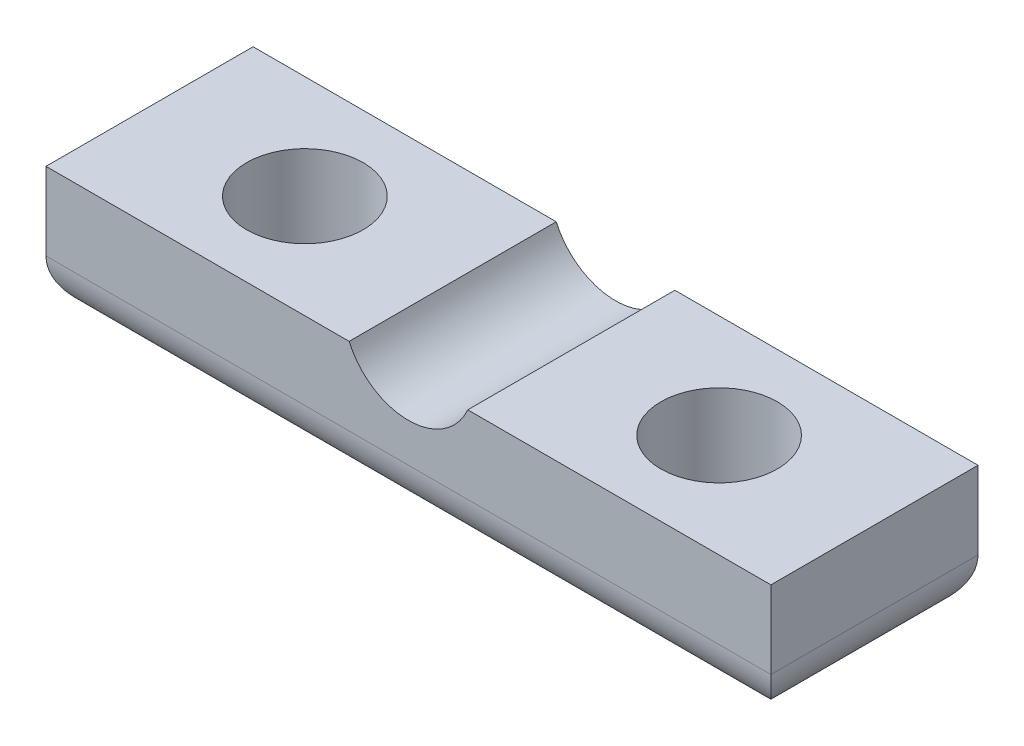
ISO-10303-21;
HEADER;
FILE_DESCRIPTION(('STEP AP214'),'2;1');
FILE_NAME('part.step','',(''),(''),'','','');
FILE_SCHEMA(('AUTOMOTIVE_DESIGN { 1 0 10303 214 1 1 1 1 }'));
ENDSEC;
DATA;
#1=APPLICATION_CONTEXT('core data for automotive mechanical design processes');
#2=APPLICATION_PROTOCOL_DEFINITION('international standard','automotive_design',2000,#1);
#3=PRODUCT_CONTEXT('',#1,'mechanical');
#4=PRODUCT('Part','Part','',(#3));
#5=PRODUCT_RELATED_PRODUCT_CATEGORY('part','',(#4));
#6=PRODUCT_DEFINITION_FORMATION('','',#4);
#7=PRODUCT_DEFINITION_CONTEXT('part definition',#1,'design');
#8=PRODUCT_DEFINITION('design','',#6,#7);
#9=PRODUCT_DEFINITION_SHAPE('','',#8);
#10=(LENGTH_UNIT() NAMED_UNIT(*) SI_UNIT(.MILLI.,.METRE.));
#11=(NAMED_UNIT(*) PLANE_ANGLE_UNIT() SI_UNIT($,.RADIAN.));
#12=(NAMED_UNIT(*) SI_UNIT($,.STERADIAN.) SOLID_ANGLE_UNIT());
#13=UNCERTAINTY_MEASURE_WITH_UNIT(LENGTH_MEASURE(1.E-05),#10,'distance_accuracy_value','');
#14=(GEOMETRIC_REPRESENTATION_CONTEXT(3) GLOBAL_UNCERTAINTY_ASSIGNED_CONTEXT((#13)) GLOBAL_UNIT_ASSIGNED_CONTEXT((#10,
#11,#12)) REPRESENTATION_CONTEXT('',''));
#15=CARTESIAN_POINT('',(0.,0.,0.));
#16=DIRECTION('',(0.,0.,1.));
#17=DIRECTION('',(1.,0.,0.));
#18=AXIS2_PLACEMENT_3D('',#15,#16,#17);
#19=CARTESIAN_POINT('',(0.,0.,0.));
#20=DIRECTION('',(0.,1.,0.));
#21=DIRECTION('',(0.,0.,1.));
#22=AXIS2_PLACEMENT_3D('',#19,#20,#21);
#23=PLANE('',#22);
#24=CARTESIAN_POINT('',(6.,0.,-4.));
#25=DIRECTION('',(0.,1.,0.));
#26=DIRECTION('',(0.,0.,1.));
#27=AXIS2_PLACEMENT_3D('',#24,#25,#26);
#28=CIRCLE('',#27,2.25);
#29=CARTESIAN_POINT('',(7.03077640640442,0.,-2.));
#30=VERTEX_POINT('',#29);
#31=CARTESIAN_POINT('',(7.03077640640442,0.,-6.));
#32=VERTEX_POINT('',#31);
#33=EDGE_CURVE('E298',#30,#32,#28,.T.);
#34=ORIENTED_EDGE('',*,*,#33,.T.);
#35=DIRECTION('',(-1.,0.,0.));
#36=VECTOR('',#35,1.);
#37=CARTESIAN_POINT('',(0.,0.,-6.));
#38=LINE('',#37,#36);
#39=CARTESIAN_POINT('',(20.9692235935956,0.,-6.));
#40=VERTEX_POINT('',#39);
#41=EDGE_CURVE('E193',#32,#40,#38,.F.);
#42=ORIENTED_EDGE('',*,*,#41,.T.);
#43=CARTESIAN_POINT('',(22.,0.,-4.));
#44=DIRECTION('',(0.,1.,0.));
#45=DIRECTION('',(0.,0.,1.));
#46=AXIS2_PLACEMENT_3D('',#43,#44,#45);
#47=CIRCLE('',#46,2.25);
#48=CARTESIAN_POINT('',(20.9692235935956,0.,-2.));
#49=VERTEX_POINT('',#48);
#50=EDGE_CURVE('E290',#40,#49,#47,.T.);
#51=ORIENTED_EDGE('',*,*,#50,.T.);
#52=DIRECTION('',(1.,0.,0.));
#53=VECTOR('',#52,1.);
#54=CARTESIAN_POINT('',(0.,0.,-2.));
#55=LINE('',#54,#53);
#56=EDGE_CURVE('E185',#49,#30,#55,.F.);
#57=ORIENTED_EDGE('',*,*,#56,.T.);
#58=EDGE_LOOP('',(#34,#42,#51,#57));
#59=FACE_BOUND('',#58,.T.);
#60=ADVANCED_FACE('F41',(#59),#23,.F.);
#61=CARTESIAN_POINT('',(23.0307764064044,0.,-2.));
#62=VERTEX_POINT('',#61);
#63=CARTESIAN_POINT('',(23.0307764064044,0.,-6.));
#64=VERTEX_POINT('',#63);
#65=EDGE_CURVE('E283',#62,#64,#47,.T.);
#66=ORIENTED_EDGE('',*,*,#65,.T.);
#67=DIRECTION('',(-1.,0.,0.));
#68=VECTOR('',#67,1.);
#69=CARTESIAN_POINT('',(0.,0.,-6.));
#70=LINE('',#69,#68);
#71=CARTESIAN_POINT('',(26.,0.,-6.));
#72=VERTEX_POINT('',#71);
#73=EDGE_CURVE('E191',#64,#72,#70,.F.);
#74=ORIENTED_EDGE('',*,*,#73,.T.);
#75=DIRECTION('',(0.,0.,-1.));
#76=VECTOR('',#75,1.);
#77=CARTESIAN_POINT('',(26.,0.,0.));
#78=LINE('',#77,#76);
#79=CARTESIAN_POINT('',(26.,0.,-2.));
#80=VERTEX_POINT('',#79);
#81=EDGE_CURVE('E189',#72,#80,#78,.F.);
#82=ORIENTED_EDGE('',*,*,#81,.T.);
#83=DIRECTION('',(1.,0.,0.));
#84=VECTOR('',#83,1.);
#85=CARTESIAN_POINT('',(0.,0.,-2.));
#86=LINE('',#85,#84);
#87=EDGE_CURVE('E187',#80,#62,#86,.F.);
#88=ORIENTED_EDGE('',*,*,#87,.T.);
#89=EDGE_LOOP('',(#66,#74,#82,#88));
#90=FACE_BOUND('',#89,.T.);
#91=ADVANCED_FACE('F228',(#90),#23,.F.);
#92=CARTESIAN_POINT('',(0.,5.,0.));
#93=DIRECTION('',(0.,1.,0.));
#94=DIRECTION('',(0.,0.,1.));
#95=AXIS2_PLACEMENT_3D('',#92,#93,#94);
#96=PLANE('',#95);
#97=DIRECTION('',(0.,0.,1.));
#98=VECTOR('',#97,1.);
#99=CARTESIAN_POINT('',(11.7087121525221,5.,-8.001));
#100=LINE('',#99,#98);
#101=CARTESIAN_POINT('',(11.7087121525221,5.,0.));
#102=VERTEX_POINT('',#101);
#103=CARTESIAN_POINT('',(11.7087121525221,5.,-8.));
#104=VERTEX_POINT('',#103);
#105=EDGE_CURVE('E139',#102,#104,#100,.F.);
#106=ORIENTED_EDGE('',*,*,#105,.T.);
#107=DIRECTION('',(-1.,0.,0.));
#108=VECTOR('',#107,1.);
#109=CARTESIAN_POINT('',(0.,5.,-8.));
#110=LINE('',#109,#108);
#111=CARTESIAN_POINT('',(0.,5.,-8.));
#112=VERTEX_POINT('',#111);
#113=EDGE_CURVE('E165',#104,#112,#110,.T.);
#114=ORIENTED_EDGE('',*,*,#113,.T.);
#115=DIRECTION('',(0.,0.,1.));
#116=VECTOR('',#115,1.);
#117=CARTESIAN_POINT('',(0.,5.,-8.));
#118=LINE('',#117,#116);
#119=CARTESIAN_POINT('',(0.,5.,0.));
#120=VERTEX_POINT('',#119);
#121=EDGE_CURVE('E156',#112,#120,#118,.T.);
#122=ORIENTED_EDGE('',*,*,#121,.T.);
#123=DIRECTION('',(1.,0.,0.));
#124=VECTOR('',#123,1.);
#125=CARTESIAN_POINT('',(0.,5.,0.));
#126=LINE('',#125,#124);
#127=EDGE_CURVE('E155',#120,#102,#126,.T.);
#128=ORIENTED_EDGE('',*,*,#127,.T.);
#129=EDGE_LOOP('',(#106,#114,#122,#128));
#130=FACE_BOUND('',#129,.T.);
#131=CARTESIAN_POINT('',(6.,5.,-4.));
#132=DIRECTION('',(0.,1.,0.));
#133=DIRECTION('',(0.,0.,1.));
#134=AXIS2_PLACEMENT_3D('',#131,#132,#133);
#135=CIRCLE('',#134,2.25);
#136=CARTESIAN_POINT('',(6.,5.,-1.75));
#137=VERTEX_POINT('',#136);
#138=EDGE_CURVE('E160',#137,#137,#135,.T.);
#139=ORIENTED_EDGE('',*,*,#138,.F.);
#140=EDGE_LOOP('',(#139));
#141=FACE_BOUND('',#140,.T.);
#142=ADVANCED_FACE('F223',(#130,#141),#96,.T.);
#143=DIRECTION('',(0.,0.,1.));
#144=VECTOR('',#143,1.);
#145=CARTESIAN_POINT('',(16.2912878474779,5.,-8.001));
#146=LINE('',#145,#144);
#147=CARTESIAN_POINT('',(16.2912878474779,5.,-8.));
#148=VERTEX_POINT('',#147);
#149=CARTESIAN_POINT('',(16.2912878474779,5.,0.));
#150=VERTEX_POINT('',#149);
#151=EDGE_CURVE('E136',#148,#150,#146,.T.);
#152=ORIENTED_EDGE('',*,*,#151,.T.);
#153=CARTESIAN_POINT('',(28.,5.,0.));
#154=VERTEX_POINT('',#153);
#155=EDGE_CURVE('E148',#150,#154,#126,.T.);
#156=ORIENTED_EDGE('',*,*,#155,.T.);
#157=DIRECTION('',(0.,0.,-1.));
#158=VECTOR('',#157,1.);
#159=CARTESIAN_POINT('',(28.,5.,-8.));
#160=LINE('',#159,#158);
#161=CARTESIAN_POINT('',(28.,5.,-8.));
#162=VERTEX_POINT('',#161);
#163=EDGE_CURVE('E158',#154,#162,#160,.T.);
#164=ORIENTED_EDGE('',*,*,#163,.T.);
#165=EDGE_CURVE('E150',#162,#148,#110,.T.);
#166=ORIENTED_EDGE('',*,*,#165,.T.);
#167=EDGE_LOOP('',(#152,#156,#164,#166));
#168=FACE_BOUND('',#167,.T.);
#169=CARTESIAN_POINT('',(22.,5.,-4.));
#170=DIRECTION('',(0.,1.,0.));
#171=DIRECTION('',(0.,0.,1.));
#172=AXIS2_PLACEMENT_3D('',#169,#170,#171);
#173=CIRCLE('',#172,2.25);
#174=CARTESIAN_POINT('',(22.,5.,-1.75));
#175=VERTEX_POINT('',#174);
#176=EDGE_CURVE('E289',#175,#175,#173,.T.);
#177=ORIENTED_EDGE('',*,*,#176,.F.);
#178=EDGE_LOOP('',(#177));
#179=FACE_BOUND('',#178,.T.);
#180=ADVANCED_FACE('F146',(#168,#179),#96,.T.);
#181=DIRECTION('',(0.,0.,1.));
#182=VECTOR('',#181,1.);
#183=CARTESIAN_POINT('',(2.,0.,0.));
#184=LINE('',#183,#182);
#185=CARTESIAN_POINT('',(2.,0.,-2.));
#186=VERTEX_POINT('',#185);
#187=CARTESIAN_POINT('',(2.,0.,-6.));
#188=VERTEX_POINT('',#187);
#189=EDGE_CURVE('E180',#186,#188,#184,.F.);
#190=ORIENTED_EDGE('',*,*,#189,.T.);
#191=DIRECTION('',(-1.,0.,0.));
#192=VECTOR('',#191,1.);
#193=CARTESIAN_POINT('',(0.,0.,-6.));
#194=LINE('',#193,#192);
#195=CARTESIAN_POINT('',(4.96922359359558,0.,-6.));
#196=VERTEX_POINT('',#195);
#197=EDGE_CURVE('E182',#188,#196,#194,.F.);
#198=ORIENTED_EDGE('',*,*,#197,.T.);
#199=CARTESIAN_POINT('',(4.96922359359558,0.,-2.));
#200=VERTEX_POINT('',#199);
#201=EDGE_CURVE('E293',#196,#200,#28,.T.);
#202=ORIENTED_EDGE('',*,*,#201,.T.);
#203=DIRECTION('',(1.,0.,0.));
#204=VECTOR('',#203,1.);
#205=CARTESIAN_POINT('',(0.,0.,-2.));
#206=LINE('',#205,#204);
#207=EDGE_CURVE('E178',#200,#186,#206,.F.);
#208=ORIENTED_EDGE('',*,*,#207,.T.);
#209=EDGE_LOOP('',(#190,#198,#202,#208));
#210=FACE_BOUND('',#209,.T.);
#211=ADVANCED_FACE('F222',(#210),#23,.F.);
#212=CARTESIAN_POINT('',(0.,5.,-8.));
#213=DIRECTION('',(1.,0.,0.));
#214=DIRECTION('',(0.,0.,-1.));
#215=AXIS2_PLACEMENT_3D('',#212,#213,#214);
#216=PLANE('',#215);
#217=DIRECTION('',(0.,-1.,0.));
#218=VECTOR('',#217,1.);
#219=CARTESIAN_POINT('',(0.,5.,-8.));
#220=LINE('',#219,#218);
#221=CARTESIAN_POINT('',(0.,2.,-8.));
#222=VERTEX_POINT('',#221);
#223=EDGE_CURVE('E167',#112,#222,#220,.T.);
#224=ORIENTED_EDGE('',*,*,#223,.T.);
#225=DIRECTION('',(0.,0.,1.));
#226=VECTOR('',#225,1.);
#227=CARTESIAN_POINT('',(0.,2.,-8.));
#228=LINE('',#227,#226);
#229=CARTESIAN_POINT('',(0.,2.,0.));
#230=VERTEX_POINT('',#229);
#231=EDGE_CURVE('E65',#222,#230,#228,.T.);
#232=ORIENTED_EDGE('',*,*,#231,.T.);
#233=DIRECTION('',(0.,-1.,0.));
#234=VECTOR('',#233,1.);
#235=CARTESIAN_POINT('',(0.,5.,0.));
#236=LINE('',#235,#234);
#237=EDGE_CURVE('E173',#120,#230,#236,.T.);
#238=ORIENTED_EDGE('',*,*,#237,.F.);
#239=ORIENTED_EDGE('',*,*,#121,.F.);
#240=EDGE_LOOP('',(#224,#232,#238,#239));
#241=FACE_BOUND('',#240,.T.);
#242=ADVANCED_FACE('F226',(#241),#216,.F.);
#243=CARTESIAN_POINT('',(0.,5.,0.));
#244=DIRECTION('',(0.,0.,-1.));
#245=DIRECTION('',(-1.,0.,0.));
#246=AXIS2_PLACEMENT_3D('',#243,#244,#245);
#247=PLANE('',#246);
#248=ORIENTED_EDGE('',*,*,#237,.T.);
#249=DIRECTION('',(1.,0.,0.));
#250=VECTOR('',#249,1.);
#251=CARTESIAN_POINT('',(0.,2.,0.));
#252=LINE('',#251,#250);
#253=CARTESIAN_POINT('',(28.,2.,0.));
#254=VERTEX_POINT('',#253);
#255=EDGE_CURVE('E11',#230,#254,#252,.T.);
#256=ORIENTED_EDGE('',*,*,#255,.T.);
#257=DIRECTION('',(0.,-1.,0.));
#258=VECTOR('',#257,1.);
#259=CARTESIAN_POINT('',(28.,5.,0.));
#260=LINE('',#259,#258);
#261=EDGE_CURVE('E153',#154,#254,#260,.T.);
#262=ORIENTED_EDGE('',*,*,#261,.F.);
#263=ORIENTED_EDGE('',*,*,#155,.F.);
#264=CARTESIAN_POINT('',(14.,6.,0.));
#265=DIRECTION('',(0.,0.,1.));
#266=DIRECTION('',(1.,0.,0.));
#267=AXIS2_PLACEMENT_3D('',#264,#265,#266);
#268=CIRCLE('',#267,2.5);
#269=EDGE_CURVE('E133',#102,#150,#268,.T.);
#270=ORIENTED_EDGE('',*,*,#269,.F.);
#271=ORIENTED_EDGE('',*,*,#127,.F.);
#272=EDGE_LOOP('',(#248,#256,#262,#263,#270,#271));
#273=FACE_BOUND('',#272,.T.);
#274=ADVANCED_FACE('F152',(#273),#247,.F.);
#275=CARTESIAN_POINT('',(28.,5.,-8.));
#276=DIRECTION('',(-1.,0.,0.));
#277=DIRECTION('',(0.,0.,1.));
#278=AXIS2_PLACEMENT_3D('',#275,#276,#277);
#279=PLANE('',#278);
#280=ORIENTED_EDGE('',*,*,#261,.T.);
#281=DIRECTION('',(0.,0.,-1.));
#282=VECTOR('',#281,1.);
#283=CARTESIAN_POINT('',(28.,2.,-8.));
#284=LINE('',#283,#282);
#285=CARTESIAN_POINT('',(28.,2.,-8.));
#286=VERTEX_POINT('',#285);
#287=EDGE_CURVE('E51',#254,#286,#284,.T.);
#288=ORIENTED_EDGE('',*,*,#287,.T.);
#289=DIRECTION('',(0.,-1.,0.));
#290=VECTOR('',#289,1.);
#291=CARTESIAN_POINT('',(28.,5.,-8.));
#292=LINE('',#291,#290);
#293=EDGE_CURVE('E169',#162,#286,#292,.T.);
#294=ORIENTED_EDGE('',*,*,#293,.F.);
#295=ORIENTED_EDGE('',*,*,#163,.F.);
#296=EDGE_LOOP('',(#280,#288,#294,#295));
#297=FACE_BOUND('',#296,.T.);
#298=ADVANCED_FACE('F231',(#297),#279,.F.);
#299=CARTESIAN_POINT('',(0.,5.,-8.));
#300=DIRECTION('',(0.,0.,1.));
#301=DIRECTION('',(1.,0.,0.));
#302=AXIS2_PLACEMENT_3D('',#299,#300,#301);
#303=PLANE('',#302);
#304=ORIENTED_EDGE('',*,*,#293,.T.);
#305=DIRECTION('',(-1.,0.,0.));
#306=VECTOR('',#305,1.);
#307=CARTESIAN_POINT('',(0.,2.,-8.));
#308=LINE('',#307,#306);
#309=EDGE_CURVE('E175',#286,#222,#308,.T.);
#310=ORIENTED_EDGE('',*,*,#309,.T.);
#311=ORIENTED_EDGE('',*,*,#223,.F.);
#312=ORIENTED_EDGE('',*,*,#113,.F.);
#313=CARTESIAN_POINT('',(14.,6.,-8.));
#314=DIRECTION('',(0.,0.,1.));
#315=DIRECTION('',(1.,0.,0.));
#316=AXIS2_PLACEMENT_3D('',#313,#314,#315);
#317=CIRCLE('',#316,2.5);
#318=EDGE_CURVE('E142',#148,#104,#317,.F.);
#319=ORIENTED_EDGE('',*,*,#318,.F.);
#320=ORIENTED_EDGE('',*,*,#165,.F.);
#321=EDGE_LOOP('',(#304,#310,#311,#312,#319,#320));
#322=FACE_BOUND('',#321,.T.);
#323=ADVANCED_FACE('F215',(#322),#303,.F.);
#324=CARTESIAN_POINT('',(6.,5.,-4.));
#325=DIRECTION('',(0.,-1.,0.));
#326=DIRECTION('',(0.,0.,-1.));
#327=AXIS2_PLACEMENT_3D('',#324,#325,#326);
#328=CYLINDRICAL_SURFACE('',#327,2.25);
#329=ORIENTED_EDGE('',*,*,#138,.T.);
#330=EDGE_LOOP('',(#329));
#331=FACE_BOUND('',#330,.T.);
#332=ORIENTED_EDGE('',*,*,#201,.F.);
#333=CARTESIAN_POINT('',(4.96922359359558,0.,-6.));
#334=CARTESIAN_POINT('',(5.02539735107105,1.52558001636132E-05,-6.02895862122767));
#335=CARTESIAN_POINT('',(5.08278963496504,0.000629627856996924,-6.05553535569634));
#336=CARTESIAN_POINT('',(5.19959134872419,0.00254373186729327,-6.10376565723493));
#337=CARTESIAN_POINT('',(5.25900060992354,0.00384340664507496,-6.12541963480109));
#338=CARTESIAN_POINT('',(5.3793536073234,0.00661375347529402,-6.1636269681991));
#339=CARTESIAN_POINT('',(5.44029541606852,0.00808421840381634,-6.18018641520903));
#340=CARTESIAN_POINT('',(5.56335885030774,0.0108088193640124,-6.20812706255428));
#341=CARTESIAN_POINT('',(5.62548045408171,0.0120629593739709,-6.21950835812376));
#342=CARTESIAN_POINT('',(5.75051567773631,0.0140743725760321,-6.23701710175278));
#343=CARTESIAN_POINT('',(5.81342985237115,0.0148312754900123,-6.24314063554815));
#344=CARTESIAN_POINT('',(5.93957760880453,0.0156930077279623,-6.25007588346231));
#345=CARTESIAN_POINT('',(6.00281130113264,0.0157975933784894,-6.25088561261258));
#346=CARTESIAN_POINT('',(6.12907583671838,0.0153323700147689,-6.24718128194423));
#347=CARTESIAN_POINT('',(6.19210679764039,0.0147630736245386,-6.24267126887807));
#348=CARTESIAN_POINT('',(6.31756317267604,0.0130690887375425,-6.22837296318195));
#349=CARTESIAN_POINT('',(6.37998839081447,0.0119442262316625,-6.21858301673324));
#350=CARTESIAN_POINT('',(6.54416887162481,0.008527509013293,-6.18568855561695));
#351=CARTESIAN_POINT('',(6.64506499516112,0.0059527108171159,-6.1580651499093));
#352=CARTESIAN_POINT('',(6.7927274994465,0.0027584431031845,-6.10637480077624));
#353=CARTESIAN_POINT('',(6.8413493783086,0.00180481476181779,-6.08742793214148));
#354=CARTESIAN_POINT('',(6.9371758863136,0.000427731988449566,-6.04619612932464));
#355=CARTESIAN_POINT('',(6.98438021558466,4.38897384282001E-06,-6.02391049474071));
#356=CARTESIAN_POINT('',(7.03077640640442,0.,-6.));
#357=B_SPLINE_CURVE_WITH_KNOTS('',3,(#333,#334,#335,#336,#337,#338,#339,#340,#341,#342,#343,
#344,#345,#346,#347,#348,#349,#350,#351,#352,#353,#354,#355,#356),.UNSPECIFIED.,.F.,.F.,(4,2,2,
2,2,2,2,2,2,2,2,4),(0.,0.189526602351568,0.379037394757997,0.568320713639339,0.757600551168464,
0.947021180636778,1.13651256404109,1.32585989338827,1.51526656594334,1.82800916052711,
1.98447854453795,2.14098079856731),.UNSPECIFIED.);
#358=EDGE_CURVE('E202',#196,#32,#357,.T.);
#359=ORIENTED_EDGE('',*,*,#358,.T.);
#360=ORIENTED_EDGE('',*,*,#33,.F.);
#361=CARTESIAN_POINT('',(7.03077640640442,0.,-2.));
#362=CARTESIAN_POINT('',(6.97460264892895,1.52558001637052E-05,-1.97104137877233));
#363=CARTESIAN_POINT('',(6.91721036503496,0.000629627856996939,-1.94446464430366));
#364=CARTESIAN_POINT('',(6.80040865127581,0.00254373186729314,-1.89623434276507));
#365=CARTESIAN_POINT('',(6.74099939007646,0.00384340664507478,-1.87458036519891));
#366=CARTESIAN_POINT('',(6.6206463926766,0.00661375347529411,-1.8363730318009));
#367=CARTESIAN_POINT('',(6.55970458393148,0.00808421840381675,-1.81981358479097));
#368=CARTESIAN_POINT('',(6.43664114969226,0.0108088193640128,-1.79187293744572));
#369=CARTESIAN_POINT('',(6.37451954591829,0.0120629593739708,-1.78049164187624));
#370=CARTESIAN_POINT('',(6.24948432226369,0.014074372576032,-1.76298289824721));
#371=CARTESIAN_POINT('',(6.18657014762885,0.0148312754900126,-1.75685936445185));
#372=CARTESIAN_POINT('',(6.06042239119547,0.0156930077279627,-1.74992411653769));
#373=CARTESIAN_POINT('',(5.99718869886736,0.0157975933784894,-1.74911438738742));
#374=CARTESIAN_POINT('',(5.87092416328162,0.0153323700147688,-1.75281871805577));
#375=CARTESIAN_POINT('',(5.80789320235961,0.0147630736245389,-1.75732873112193));
#376=CARTESIAN_POINT('',(5.68243682732396,0.0130690887375429,-1.77162703681805));
#377=CARTESIAN_POINT('',(5.62001160918553,0.0119442262316626,-1.78141698326676));
#378=CARTESIAN_POINT('',(5.45583112837519,0.00852750901329275,-1.81431144438305));
#379=CARTESIAN_POINT('',(5.35493500483888,0.00595271081711586,-1.8419348500907));
#380=CARTESIAN_POINT('',(5.2072725005535,0.00275844310318455,-1.89362519922376));
#381=CARTESIAN_POINT('',(5.1586506216914,0.00180481476181783,-1.91257206785852));
#382=CARTESIAN_POINT('',(5.0628241136864,0.000427731988449564,-1.95380387067536));
#383=CARTESIAN_POINT('',(5.01561978441534,4.38897384279923E-06,-1.97608950525929));
#384=CARTESIAN_POINT('',(4.96922359359558,0.,-2.));
#385=B_SPLINE_CURVE_WITH_KNOTS('',3,(#361,#362,#363,#364,#365,#366,#367,#368,#369,#370,#371,
#372,#373,#374,#375,#376,#377,#378,#379,#380,#381,#382,#383,#384),.UNSPECIFIED.,.F.,.F.,(4,2,2,
2,2,2,2,2,2,2,2,4),(0.,0.189526602351567,0.379037394757997,0.568320713639341,0.757600551168464,
0.947021180636777,1.13651256404109,1.32585989338827,1.51526656594334,1.82800916052711,
1.98447854453795,2.14098079856731),.UNSPECIFIED.);
#386=EDGE_CURVE('E195',#30,#200,#385,.T.);
#387=ORIENTED_EDGE('',*,*,#386,.T.);
#388=EDGE_LOOP('',(#332,#359,#360,#387));
#389=FACE_BOUND('',#388,.T.);
#390=ADVANCED_FACE('F209',(#331,#389),#328,.F.);
#391=CARTESIAN_POINT('',(22.,5.,-4.));
#392=DIRECTION('',(0.,-1.,0.));
#393=DIRECTION('',(0.,0.,-1.));
#394=AXIS2_PLACEMENT_3D('',#391,#392,#393);
#395=CYLINDRICAL_SURFACE('',#394,2.25);
#396=ORIENTED_EDGE('',*,*,#176,.T.);
#397=EDGE_LOOP('',(#396));
#398=FACE_BOUND('',#397,.T.);
#399=ORIENTED_EDGE('',*,*,#50,.F.);
#400=CARTESIAN_POINT('',(20.9692235935956,0.,-6.));
#401=CARTESIAN_POINT('',(21.0253973510711,1.52558001640079E-05,-6.02895862122767));
#402=CARTESIAN_POINT('',(21.082789634965,0.000629627856997276,-6.05553535569634));
#403=CARTESIAN_POINT('',(21.1995913487242,0.00254373186729338,-6.10376565723493));
#404=CARTESIAN_POINT('',(21.2590006099235,0.00384340664507488,-6.12541963480109));
#405=CARTESIAN_POINT('',(21.3793536073234,0.00661375347529412,-6.1636269681991));
#406=CARTESIAN_POINT('',(21.4402954160685,0.00808421840381682,-6.18018641520903));
#407=CARTESIAN_POINT('',(21.5633588503077,0.0108088193640131,-6.20812706255427));
#408=CARTESIAN_POINT('',(21.6254804540817,0.0120629593739714,-6.21950835812376));
#409=CARTESIAN_POINT('',(21.7505156777363,0.0140743725760324,-6.23701710175278));
#410=CARTESIAN_POINT('',(21.8134298523712,0.0148312754900125,-6.24314063554815));
#411=CARTESIAN_POINT('',(21.9395776088045,0.0156930077279623,-6.2500758834623));
#412=CARTESIAN_POINT('',(22.0028113011326,0.0157975933784892,-6.25088561261258));
#413=CARTESIAN_POINT('',(22.1290758367184,0.0153323700147685,-6.24718128194423));
#414=CARTESIAN_POINT('',(22.1921067976404,0.0147630736245382,-6.24267126887807));
#415=CARTESIAN_POINT('',(22.317563172676,0.0130690887375421,-6.22837296318195));
#416=CARTESIAN_POINT('',(22.3799883908145,0.0119442262316621,-6.21858301673324));
#417=CARTESIAN_POINT('',(22.5441688716248,0.0085275090132926,-6.18568855561695));
#418=CARTESIAN_POINT('',(22.6450649951611,0.0059527108171154,-6.1580651499093));
#419=CARTESIAN_POINT('',(22.7927274994465,0.00275844310318408,-6.10637480077623));
#420=CARTESIAN_POINT('',(22.8413493783086,0.00180481476181744,-6.08742793214147));
#421=CARTESIAN_POINT('',(22.9371758863136,0.000427731988449439,-6.04619612932464));
#422=CARTESIAN_POINT('',(22.9843802155847,4.38897384285513E-06,-6.02391049474071));
#423=CARTESIAN_POINT('',(23.0307764064044,0.,-6.));
#424=B_SPLINE_CURVE_WITH_KNOTS('',3,(#400,#401,#402,#403,#404,#405,#406,#407,#408,#409,#410,
#411,#412,#413,#414,#415,#416,#417,#418,#419,#420,#421,#422,#423),.UNSPECIFIED.,.F.,.F.,(4,2,2,
2,2,2,2,2,2,2,2,4),(0.,0.189526602351569,0.379037394758,0.568320713639339,0.757600551168462,
0.947021180636776,1.13651256404109,1.32585989338826,1.51526656594334,1.82800916052711,
1.98447854453794,2.1409807985673),.UNSPECIFIED.);
#425=EDGE_CURVE('E247',#40,#64,#424,.T.);
#426=ORIENTED_EDGE('',*,*,#425,.T.);
#427=ORIENTED_EDGE('',*,*,#65,.F.);
#428=CARTESIAN_POINT('',(23.0307764064044,0.,-2.));
#429=CARTESIAN_POINT('',(22.9746026489289,1.52558001639053E-05,-1.97104137877233));
#430=CARTESIAN_POINT('',(22.917210365035,0.000629627856997255,-1.94446464430366));
#431=CARTESIAN_POINT('',(22.8004086512758,0.00254373186729352,-1.89623434276507));
#432=CARTESIAN_POINT('',(22.7409993900765,0.0038434066450751,-1.87458036519891));
#433=CARTESIAN_POINT('',(22.6206463926766,0.00661375347529413,-1.8363730318009));
#434=CARTESIAN_POINT('',(22.5597045839315,0.00808421840381654,-1.81981358479097));
#435=CARTESIAN_POINT('',(22.4366411496923,0.0108088193640128,-1.79187293744573));
#436=CARTESIAN_POINT('',(22.3745195459183,0.0120629593739713,-1.78049164187624));
#437=CARTESIAN_POINT('',(22.2494843222637,0.0140743725760325,-1.76298289824722));
#438=CARTESIAN_POINT('',(22.1865701476288,0.0148312754900126,-1.75685936445185));
#439=CARTESIAN_POINT('',(22.0604223911955,0.0156930077279622,-1.74992411653769));
#440=CARTESIAN_POINT('',(21.9971886988674,0.0157975933784889,-1.74911438738742));
#441=CARTESIAN_POINT('',(21.8709241632816,0.0153323700147684,-1.75281871805577));
#442=CARTESIAN_POINT('',(21.8078932023596,0.0147630736245385,-1.75732873112193));
#443=CARTESIAN_POINT('',(21.682436827324,0.0130690887375425,-1.77162703681805));
#444=CARTESIAN_POINT('',(21.6200116091855,0.0119442262316622,-1.78141698326676));
#445=CARTESIAN_POINT('',(21.4558311283752,0.00852750901329234,-1.81431144438305));
#446=CARTESIAN_POINT('',(21.3549350048389,0.00595271081711535,-1.8419348500907));
#447=CARTESIAN_POINT('',(21.2072725005535,0.00275844310318411,-1.89362519922377));
#448=CARTESIAN_POINT('',(21.1586506216914,0.00180481476181744,-1.91257206785853));
#449=CARTESIAN_POINT('',(21.0628241136864,0.000427731988449417,-1.95380387067537));
#450=CARTESIAN_POINT('',(21.0156197844153,4.38897384282678E-06,-1.9760895052593));
#451=CARTESIAN_POINT('',(20.9692235935956,0.,-2.));
#452=B_SPLINE_CURVE_WITH_KNOTS('',3,(#428,#429,#430,#431,#432,#433,#434,#435,#436,#437,#438,
#439,#440,#441,#442,#443,#444,#445,#446,#447,#448,#449,#450,#451),.UNSPECIFIED.,.F.,.F.,(4,2,2,
2,2,2,2,2,2,2,2,4),(0.,0.189526602351569,0.379037394758,0.568320713639339,0.757600551168462,
0.947021180636772,1.13651256404108,1.32585989338826,1.51526656594334,1.82800916052711,
1.98447854453795,2.14098079856731),.UNSPECIFIED.);
#453=EDGE_CURVE('E253',#62,#49,#452,.T.);
#454=ORIENTED_EDGE('',*,*,#453,.T.);
#455=EDGE_LOOP('',(#399,#426,#427,#454));
#456=FACE_BOUND('',#455,.T.);
#457=ADVANCED_FACE('F214',(#398,#456),#395,.F.);
#458=CARTESIAN_POINT('',(14.,6.,-8.001));
#459=DIRECTION('',(0.,0.,1.));
#460=DIRECTION('',(1.,0.,0.));
#461=AXIS2_PLACEMENT_3D('',#458,#459,#460);
#462=CYLINDRICAL_SURFACE('',#461,2.5);
#463=ORIENTED_EDGE('',*,*,#269,.T.);
#464=ORIENTED_EDGE('',*,*,#151,.F.);
#465=ORIENTED_EDGE('',*,*,#318,.T.);
#466=ORIENTED_EDGE('',*,*,#105,.F.);
#467=EDGE_LOOP('',(#463,#464,#465,#466));
#468=FACE_BOUND('',#467,.T.);
#469=ADVANCED_FACE('F135',(#468),#462,.F.);
#470=CARTESIAN_POINT('',(0.,2.,-2.));
#471=DIRECTION('',(1.,0.,0.));
#472=DIRECTION('',(0.,0.,-1.));
#473=AXIS2_PLACEMENT_3D('',#470,#471,#472);
#474=CYLINDRICAL_SURFACE('',#473,2.);
#475=ORIENTED_EDGE('',*,*,#453,.F.);
#476=ORIENTED_EDGE('',*,*,#87,.F.);
#477=CARTESIAN_POINT('',(26.,2.,-2.));
#478=DIRECTION('',(0.707106781186547,0.,-0.707106781186548));
#479=DIRECTION('',(0.707106781186548,0.,0.707106781186547));
#480=AXIS2_PLACEMENT_3D('',#477,#478,#479);
#481=ELLIPSE('',#480,2.82842712474619,2.);
#482=EDGE_CURVE('E46',#254,#80,#481,.T.);
#483=ORIENTED_EDGE('',*,*,#482,.F.);
#484=ORIENTED_EDGE('',*,*,#255,.F.);
#485=CARTESIAN_POINT('',(2.,2.,-2.));
#486=DIRECTION('',(0.707106781186548,0.,0.707106781186547));
#487=DIRECTION('',(0.707106781186547,0.,-0.707106781186548));
#488=AXIS2_PLACEMENT_3D('',#485,#486,#487);
#489=ELLIPSE('',#488,2.82842712474619,2.);
#490=EDGE_CURVE('E264',#186,#230,#489,.F.);
#491=ORIENTED_EDGE('',*,*,#490,.F.);
#492=ORIENTED_EDGE('',*,*,#207,.F.);
#493=ORIENTED_EDGE('',*,*,#386,.F.);
#494=ORIENTED_EDGE('',*,*,#56,.F.);
#495=EDGE_LOOP('',(#475,#476,#483,#484,#491,#492,#493,#494));
#496=FACE_BOUND('',#495,.T.);
#497=ADVANCED_FACE('F43',(#496),#474,.T.);
#498=CARTESIAN_POINT('',(26.,2.,-8.));
#499=DIRECTION('',(0.,0.,-1.));
#500=DIRECTION('',(-1.,0.,0.));
#501=AXIS2_PLACEMENT_3D('',#498,#499,#500);
#502=CYLINDRICAL_SURFACE('',#501,2.);
#503=ORIENTED_EDGE('',*,*,#482,.T.);
#504=ORIENTED_EDGE('',*,*,#81,.F.);
#505=CARTESIAN_POINT('',(26.,2.,-6.));
#506=DIRECTION('',(-0.707106781186548,0.,-0.707106781186547));
#507=DIRECTION('',(0.707106781186547,0.,-0.707106781186548));
#508=AXIS2_PLACEMENT_3D('',#505,#506,#507);
#509=ELLIPSE('',#508,2.82842712474619,2.);
#510=EDGE_CURVE('E262',#286,#72,#509,.T.);
#511=ORIENTED_EDGE('',*,*,#510,.F.);
#512=ORIENTED_EDGE('',*,*,#287,.F.);
#513=EDGE_LOOP('',(#503,#504,#511,#512));
#514=FACE_BOUND('',#513,.T.);
#515=ADVANCED_FACE('F274',(#514),#502,.T.);
#516=CARTESIAN_POINT('',(2.,2.,-8.));
#517=DIRECTION('',(0.,0.,1.));
#518=DIRECTION('',(1.,0.,0.));
#519=AXIS2_PLACEMENT_3D('',#516,#517,#518);
#520=CYLINDRICAL_SURFACE('',#519,2.);
#521=ORIENTED_EDGE('',*,*,#490,.T.);
#522=ORIENTED_EDGE('',*,*,#231,.F.);
#523=CARTESIAN_POINT('',(2.,2.,-6.));
#524=DIRECTION('',(-0.707106781186547,0.,0.707106781186548));
#525=DIRECTION('',(0.707106781186548,0.,0.707106781186547));
#526=AXIS2_PLACEMENT_3D('',#523,#524,#525);
#527=ELLIPSE('',#526,2.82842712474619,2.);
#528=EDGE_CURVE('E260',#188,#222,#527,.F.);
#529=ORIENTED_EDGE('',*,*,#528,.F.);
#530=ORIENTED_EDGE('',*,*,#189,.F.);
#531=EDGE_LOOP('',(#521,#522,#529,#530));
#532=FACE_BOUND('',#531,.T.);
#533=ADVANCED_FACE('F243',(#532),#520,.T.);
#534=CARTESIAN_POINT('',(0.,2.,-6.));
#535=DIRECTION('',(-1.,0.,0.));
#536=DIRECTION('',(0.,0.,1.));
#537=AXIS2_PLACEMENT_3D('',#534,#535,#536);
#538=CYLINDRICAL_SURFACE('',#537,2.);
#539=ORIENTED_EDGE('',*,*,#358,.F.);
#540=ORIENTED_EDGE('',*,*,#197,.F.);
#541=ORIENTED_EDGE('',*,*,#528,.T.);
#542=ORIENTED_EDGE('',*,*,#309,.F.);
#543=ORIENTED_EDGE('',*,*,#510,.T.);
#544=ORIENTED_EDGE('',*,*,#73,.F.);
#545=ORIENTED_EDGE('',*,*,#425,.F.);
#546=ORIENTED_EDGE('',*,*,#41,.F.);
#547=EDGE_LOOP('',(#539,#540,#541,#542,#543,#544,#545,#546));
#548=FACE_BOUND('',#547,.T.);
#549=ADVANCED_FACE('F239',(#548),#538,.T.);
#550=CLOSED_SHELL('',(#60,#91,#142,#180,#211,#242,#274,#298,#323,#390,#457,#469,#497,#515,#533,#549));
#551=MANIFOLD_SOLID_BREP('B2',#550);
#552=ADVANCED_BREP_SHAPE_REPRESENTATION('',(#18,#551),#14);
#553=SHAPE_DEFINITION_REPRESENTATION(#9,#552);
ENDSEC;
END-ISO-10303-21;
